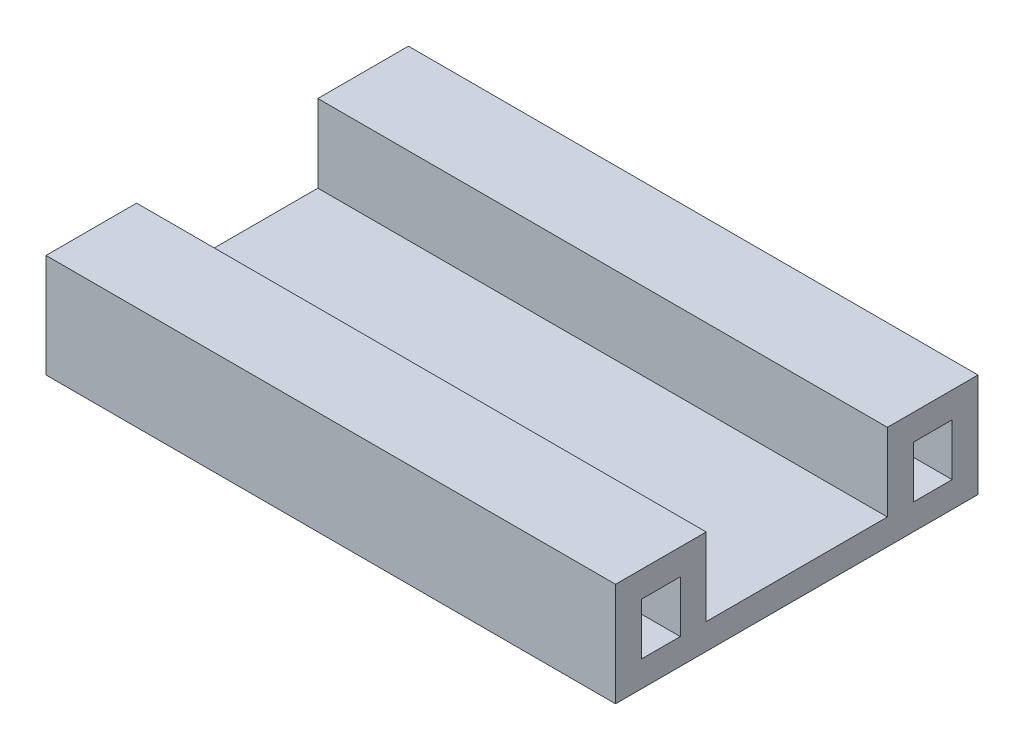
ISO-10303-21;
HEADER;
FILE_DESCRIPTION(('STEP AP214'),'2;1');
FILE_NAME('part.step','',(''),(''),'','','');
FILE_SCHEMA(('AUTOMOTIVE_DESIGN { 1 0 10303 214 1 1 1 1 }'));
ENDSEC;
DATA;
#1=APPLICATION_CONTEXT('core data for automotive mechanical design processes');
#2=APPLICATION_PROTOCOL_DEFINITION('international standard','automotive_design',2000,#1);
#3=PRODUCT_CONTEXT('',#1,'mechanical');
#4=PRODUCT('Part','Part','',(#3));
#5=PRODUCT_RELATED_PRODUCT_CATEGORY('part','',(#4));
#6=PRODUCT_DEFINITION_FORMATION('','',#4);
#7=PRODUCT_DEFINITION_CONTEXT('part definition',#1,'design');
#8=PRODUCT_DEFINITION('design','',#6,#7);
#9=PRODUCT_DEFINITION_SHAPE('','',#8);
#10=(LENGTH_UNIT() NAMED_UNIT(*) SI_UNIT(.MILLI.,.METRE.));
#11=(NAMED_UNIT(*) PLANE_ANGLE_UNIT() SI_UNIT($,.RADIAN.));
#12=(NAMED_UNIT(*) SI_UNIT($,.STERADIAN.) SOLID_ANGLE_UNIT());
#13=UNCERTAINTY_MEASURE_WITH_UNIT(LENGTH_MEASURE(1.E-05),#10,'distance_accuracy_value','');
#14=(GEOMETRIC_REPRESENTATION_CONTEXT(3) GLOBAL_UNCERTAINTY_ASSIGNED_CONTEXT((#13)) GLOBAL_UNIT_ASSIGNED_CONTEXT((#10,
#11,#12)) REPRESENTATION_CONTEXT('',''));
#15=CARTESIAN_POINT('',(0.,0.,0.));
#16=DIRECTION('',(0.,0.,1.));
#17=DIRECTION('',(1.,0.,0.));
#18=AXIS2_PLACEMENT_3D('',#15,#16,#17);
#19=CARTESIAN_POINT('',(0.,10.,0.));
#20=DIRECTION('',(0.,1.,0.));
#21=DIRECTION('',(0.,0.,1.));
#22=AXIS2_PLACEMENT_3D('',#19,#20,#21);
#23=PLANE('',#22);
#24=DIRECTION('',(1.,0.,0.));
#25=VECTOR('',#24,1.);
#26=CARTESIAN_POINT('',(-110.,10.,35.));
#27=LINE('',#26,#25);
#28=CARTESIAN_POINT('',(-110.,10.,35.));
#29=VERTEX_POINT('',#28);
#30=CARTESIAN_POINT('',(110.,10.,35.));
#31=VERTEX_POINT('',#30);
#32=EDGE_CURVE('E170',#29,#31,#27,.T.);
#33=ORIENTED_EDGE('',*,*,#32,.T.);
#34=DIRECTION('',(0.,0.,-1.));
#35=VECTOR('',#34,1.);
#36=CARTESIAN_POINT('',(110.,10.,-70.));
#37=LINE('',#36,#35);
#38=CARTESIAN_POINT('',(110.,10.,-35.));
#39=VERTEX_POINT('',#38);
#40=EDGE_CURVE('E250',#31,#39,#37,.T.);
#41=ORIENTED_EDGE('',*,*,#40,.T.);
#42=DIRECTION('',(1.,0.,0.));
#43=VECTOR('',#42,1.);
#44=CARTESIAN_POINT('',(-110.,10.,-35.));
#45=LINE('',#44,#43);
#46=CARTESIAN_POINT('',(-110.,10.,-35.));
#47=VERTEX_POINT('',#46);
#48=EDGE_CURVE('E184',#47,#39,#45,.T.);
#49=ORIENTED_EDGE('',*,*,#48,.F.);
#50=DIRECTION('',(0.,0.,1.));
#51=VECTOR('',#50,1.);
#52=CARTESIAN_POINT('',(-110.,10.,-70.));
#53=LINE('',#52,#51);
#54=EDGE_CURVE('E161',#47,#29,#53,.T.);
#55=ORIENTED_EDGE('',*,*,#54,.T.);
#56=EDGE_LOOP('',(#33,#41,#49,#55));
#57=FACE_BOUND('',#56,.T.);
#58=ADVANCED_FACE('F35',(#57),#23,.T.);
#59=DIRECTION('',(-1.,0.,0.));
#60=VECTOR('',#59,1.);
#61=CARTESIAN_POINT('',(-110.,10.,45.));
#62=LINE('',#61,#60);
#63=CARTESIAN_POINT('',(110.,10.,45.));
#64=VERTEX_POINT('',#63);
#65=CARTESIAN_POINT('',(-110.,10.,45.));
#66=VERTEX_POINT('',#65);
#67=EDGE_CURVE('E165',#64,#66,#62,.T.);
#68=ORIENTED_EDGE('',*,*,#67,.T.);
#69=CARTESIAN_POINT('',(-110.,10.,60.));
#70=VERTEX_POINT('',#69);
#71=EDGE_CURVE('E152',#66,#70,#53,.T.);
#72=ORIENTED_EDGE('',*,*,#71,.T.);
#73=DIRECTION('',(-1.,0.,0.));
#74=VECTOR('',#73,1.);
#75=CARTESIAN_POINT('',(-110.,10.,60.));
#76=LINE('',#75,#74);
#77=CARTESIAN_POINT('',(110.,10.,60.));
#78=VERTEX_POINT('',#77);
#79=EDGE_CURVE('E236',#78,#70,#76,.T.);
#80=ORIENTED_EDGE('',*,*,#79,.F.);
#81=EDGE_CURVE('E58',#78,#64,#37,.T.);
#82=ORIENTED_EDGE('',*,*,#81,.T.);
#83=EDGE_LOOP('',(#68,#72,#80,#82));
#84=FACE_BOUND('',#83,.T.);
#85=ADVANCED_FACE('F166',(#84),#23,.T.);
#86=CARTESIAN_POINT('',(-110.,10.,-60.));
#87=VERTEX_POINT('',#86);
#88=CARTESIAN_POINT('',(-110.,10.,-45.));
#89=VERTEX_POINT('',#88);
#90=EDGE_CURVE('E163',#87,#89,#53,.T.);
#91=ORIENTED_EDGE('',*,*,#90,.T.);
#92=DIRECTION('',(-1.,0.,0.));
#93=VECTOR('',#92,1.);
#94=CARTESIAN_POINT('',(-110.,10.,-45.));
#95=LINE('',#94,#93);
#96=CARTESIAN_POINT('',(110.,10.,-45.));
#97=VERTEX_POINT('',#96);
#98=EDGE_CURVE('E180',#97,#89,#95,.T.);
#99=ORIENTED_EDGE('',*,*,#98,.F.);
#100=CARTESIAN_POINT('',(110.,10.,-60.));
#101=VERTEX_POINT('',#100);
#102=EDGE_CURVE('E251',#97,#101,#37,.T.);
#103=ORIENTED_EDGE('',*,*,#102,.T.);
#104=DIRECTION('',(1.,0.,0.));
#105=VECTOR('',#104,1.);
#106=CARTESIAN_POINT('',(-110.,10.,-60.));
#107=LINE('',#106,#105);
#108=EDGE_CURVE('E220',#87,#101,#107,.T.);
#109=ORIENTED_EDGE('',*,*,#108,.F.);
#110=EDGE_LOOP('',(#91,#99,#103,#109));
#111=FACE_BOUND('',#110,.T.);
#112=ADVANCED_FACE('F301',(#111),#23,.T.);
#113=CARTESIAN_POINT('',(-110.,30.,-35.));
#114=DIRECTION('',(0.,1.,0.));
#115=DIRECTION('',(0.,0.,1.));
#116=AXIS2_PLACEMENT_3D('',#113,#114,#115);
#117=PLANE('',#116);
#118=DIRECTION('',(1.,0.,0.));
#119=VECTOR('',#118,1.);
#120=CARTESIAN_POINT('',(-110.,30.,-45.));
#121=LINE('',#120,#119);
#122=CARTESIAN_POINT('',(-110.,30.,-45.));
#123=VERTEX_POINT('',#122);
#124=CARTESIAN_POINT('',(110.,30.,-45.));
#125=VERTEX_POINT('',#124);
#126=EDGE_CURVE('E169',#123,#125,#121,.T.);
#127=ORIENTED_EDGE('',*,*,#126,.F.);
#128=DIRECTION('',(0.,0.,-1.));
#129=VECTOR('',#128,1.);
#130=CARTESIAN_POINT('',(-110.,30.,-35.));
#131=LINE('',#130,#129);
#132=CARTESIAN_POINT('',(-110.,30.,-60.));
#133=VERTEX_POINT('',#132);
#134=EDGE_CURVE('E218',#123,#133,#131,.T.);
#135=ORIENTED_EDGE('',*,*,#134,.T.);
#136=DIRECTION('',(1.,0.,0.));
#137=VECTOR('',#136,1.);
#138=CARTESIAN_POINT('',(-110.,30.,-60.));
#139=LINE('',#138,#137);
#140=CARTESIAN_POINT('',(110.,30.,-60.));
#141=VERTEX_POINT('',#140);
#142=EDGE_CURVE('E205',#133,#141,#139,.T.);
#143=ORIENTED_EDGE('',*,*,#142,.T.);
#144=DIRECTION('',(0.,0.,-1.));
#145=VECTOR('',#144,1.);
#146=CARTESIAN_POINT('',(110.,30.,-35.));
#147=LINE('',#146,#145);
#148=EDGE_CURVE('E214',#125,#141,#147,.T.);
#149=ORIENTED_EDGE('',*,*,#148,.F.);
#150=EDGE_LOOP('',(#127,#135,#143,#149));
#151=FACE_BOUND('',#150,.T.);
#152=ADVANCED_FACE('F317',(#151),#117,.F.);
#153=CARTESIAN_POINT('',(-110.,40.,-60.));
#154=DIRECTION('',(0.,0.,-1.));
#155=DIRECTION('',(-1.,0.,0.));
#156=AXIS2_PLACEMENT_3D('',#153,#154,#155);
#157=PLANE('',#156);
#158=ORIENTED_EDGE('',*,*,#142,.F.);
#159=DIRECTION('',(0.,-1.,0.));
#160=VECTOR('',#159,1.);
#161=CARTESIAN_POINT('',(-110.,40.,-60.));
#162=LINE('',#161,#160);
#163=EDGE_CURVE('E234',#133,#87,#162,.T.);
#164=ORIENTED_EDGE('',*,*,#163,.T.);
#165=ORIENTED_EDGE('',*,*,#108,.T.);
#166=DIRECTION('',(0.,-1.,0.));
#167=VECTOR('',#166,1.);
#168=CARTESIAN_POINT('',(110.,40.,-60.));
#169=LINE('',#168,#167);
#170=EDGE_CURVE('E229',#141,#101,#169,.T.);
#171=ORIENTED_EDGE('',*,*,#170,.F.);
#172=EDGE_LOOP('',(#158,#164,#165,#171));
#173=FACE_BOUND('',#172,.T.);
#174=ADVANCED_FACE('F309',(#173),#157,.F.);
#175=CARTESIAN_POINT('',(110.,10.,-70.));
#176=DIRECTION('',(-1.,0.,0.));
#177=DIRECTION('',(0.,0.,1.));
#178=AXIS2_PLACEMENT_3D('',#175,#176,#177);
#179=PLANE('',#178);
#180=DIRECTION('',(0.,1.,0.));
#181=VECTOR('',#180,1.);
#182=CARTESIAN_POINT('',(110.,-210.227155455452,45.));
#183=LINE('',#182,#181);
#184=CARTESIAN_POINT('',(110.,30.,45.));
#185=VERTEX_POINT('',#184);
#186=EDGE_CURVE('E174',#64,#185,#183,.T.);
#187=ORIENTED_EDGE('',*,*,#186,.F.);
#188=ORIENTED_EDGE('',*,*,#81,.F.);
#189=DIRECTION('',(0.,-1.,0.));
#190=VECTOR('',#189,1.);
#191=CARTESIAN_POINT('',(110.,40.,60.));
#192=LINE('',#191,#190);
#193=CARTESIAN_POINT('',(110.,30.,60.));
#194=VERTEX_POINT('',#193);
#195=EDGE_CURVE('E247',#194,#78,#192,.T.);
#196=ORIENTED_EDGE('',*,*,#195,.F.);
#197=DIRECTION('',(0.,0.,1.));
#198=VECTOR('',#197,1.);
#199=CARTESIAN_POINT('',(110.,30.,35.));
#200=LINE('',#199,#198);
#201=EDGE_CURVE('E203',#185,#194,#200,.T.);
#202=ORIENTED_EDGE('',*,*,#201,.F.);
#203=EDGE_LOOP('',(#187,#188,#196,#202));
#204=FACE_BOUND('',#203,.T.);
#205=ORIENTED_EDGE('',*,*,#102,.F.);
#206=DIRECTION('',(0.,1.,0.));
#207=VECTOR('',#206,1.);
#208=CARTESIAN_POINT('',(110.,-210.227155455452,-45.));
#209=LINE('',#208,#207);
#210=EDGE_CURVE('E187',#97,#125,#209,.T.);
#211=ORIENTED_EDGE('',*,*,#210,.T.);
#212=ORIENTED_EDGE('',*,*,#148,.T.);
#213=ORIENTED_EDGE('',*,*,#170,.T.);
#214=EDGE_LOOP('',(#205,#211,#212,#213));
#215=FACE_BOUND('',#214,.T.);
#216=DIRECTION('',(0.,0.,-1.));
#217=VECTOR('',#216,1.);
#218=CARTESIAN_POINT('',(110.,0.,-70.));
#219=LINE('',#218,#217);
#220=CARTESIAN_POINT('',(110.,0.,70.));
#221=VERTEX_POINT('',#220);
#222=CARTESIAN_POINT('',(110.,0.,-70.));
#223=VERTEX_POINT('',#222);
#224=EDGE_CURVE('E249',#221,#223,#219,.T.);
#225=ORIENTED_EDGE('',*,*,#224,.T.);
#226=DIRECTION('',(0.,-1.,0.));
#227=VECTOR('',#226,1.);
#228=CARTESIAN_POINT('',(110.,10.,-70.));
#229=LINE('',#228,#227);
#230=CARTESIAN_POINT('',(110.,40.,-70.));
#231=VERTEX_POINT('',#230);
#232=EDGE_CURVE('E11',#231,#223,#229,.T.);
#233=ORIENTED_EDGE('',*,*,#232,.F.);
#234=DIRECTION('',(0.,0.,-1.));
#235=VECTOR('',#234,1.);
#236=CARTESIAN_POINT('',(110.,40.,-70.));
#237=LINE('',#236,#235);
#238=CARTESIAN_POINT('',(110.,40.,-35.));
#239=VERTEX_POINT('',#238);
#240=EDGE_CURVE('E223',#239,#231,#237,.T.);
#241=ORIENTED_EDGE('',*,*,#240,.F.);
#242=DIRECTION('',(0.,1.,0.));
#243=VECTOR('',#242,1.);
#244=CARTESIAN_POINT('',(110.,40.,-35.));
#245=LINE('',#244,#243);
#246=EDGE_CURVE('E208',#39,#239,#245,.T.);
#247=ORIENTED_EDGE('',*,*,#246,.F.);
#248=ORIENTED_EDGE('',*,*,#40,.F.);
#249=DIRECTION('',(0.,1.,0.));
#250=VECTOR('',#249,1.);
#251=CARTESIAN_POINT('',(110.,40.,35.));
#252=LINE('',#251,#250);
#253=CARTESIAN_POINT('',(110.,40.,35.));
#254=VERTEX_POINT('',#253);
#255=EDGE_CURVE('E50',#31,#254,#252,.T.);
#256=ORIENTED_EDGE('',*,*,#255,.T.);
#257=DIRECTION('',(0.,0.,-1.));
#258=VECTOR('',#257,1.);
#259=CARTESIAN_POINT('',(110.,40.,60.));
#260=LINE('',#259,#258);
#261=CARTESIAN_POINT('',(110.,40.,70.));
#262=VERTEX_POINT('',#261);
#263=EDGE_CURVE('E237',#262,#254,#260,.T.);
#264=ORIENTED_EDGE('',*,*,#263,.F.);
#265=DIRECTION('',(0.,-1.,0.));
#266=VECTOR('',#265,1.);
#267=CARTESIAN_POINT('',(110.,10.,70.));
#268=LINE('',#267,#266);
#269=EDGE_CURVE('E253',#262,#221,#268,.T.);
#270=ORIENTED_EDGE('',*,*,#269,.T.);
#271=EDGE_LOOP('',(#225,#233,#241,#247,#248,#256,#264,#270));
#272=FACE_BOUND('',#271,.T.);
#273=ADVANCED_FACE('F37',(#204,#215,#272),#179,.F.);
#274=CARTESIAN_POINT('',(-110.,10.,-70.));
#275=DIRECTION('',(0.,0.,1.));
#276=DIRECTION('',(1.,0.,0.));
#277=AXIS2_PLACEMENT_3D('',#274,#275,#276);
#278=PLANE('',#277);
#279=DIRECTION('',(-1.,0.,0.));
#280=VECTOR('',#279,1.);
#281=CARTESIAN_POINT('',(-110.,0.,-70.));
#282=LINE('',#281,#280);
#283=CARTESIAN_POINT('',(-110.,0.,-70.));
#284=VERTEX_POINT('',#283);
#285=EDGE_CURVE('E256',#223,#284,#282,.T.);
#286=ORIENTED_EDGE('',*,*,#285,.T.);
#287=DIRECTION('',(0.,-1.,0.));
#288=VECTOR('',#287,1.);
#289=CARTESIAN_POINT('',(-110.,10.,-70.));
#290=LINE('',#289,#288);
#291=CARTESIAN_POINT('',(-110.,40.,-70.));
#292=VERTEX_POINT('',#291);
#293=EDGE_CURVE('E43',#292,#284,#290,.T.);
#294=ORIENTED_EDGE('',*,*,#293,.F.);
#295=DIRECTION('',(-1.,0.,0.));
#296=VECTOR('',#295,1.);
#297=CARTESIAN_POINT('',(-110.,40.,-70.));
#298=LINE('',#297,#296);
#299=EDGE_CURVE('E226',#231,#292,#298,.T.);
#300=ORIENTED_EDGE('',*,*,#299,.F.);
#301=ORIENTED_EDGE('',*,*,#232,.T.);
#302=EDGE_LOOP('',(#286,#294,#300,#301));
#303=FACE_BOUND('',#302,.T.);
#304=ADVANCED_FACE('F297',(#303),#278,.F.);
#305=CARTESIAN_POINT('',(-110.,10.,-70.));
#306=DIRECTION('',(1.,0.,0.));
#307=DIRECTION('',(0.,0.,-1.));
#308=AXIS2_PLACEMENT_3D('',#305,#306,#307);
#309=PLANE('',#308);
#310=DIRECTION('',(0.,-1.,0.));
#311=VECTOR('',#310,1.);
#312=CARTESIAN_POINT('',(-110.,40.,35.));
#313=LINE('',#312,#311);
#314=CARTESIAN_POINT('',(-110.,40.,35.));
#315=VERTEX_POINT('',#314);
#316=EDGE_CURVE('E193',#315,#29,#313,.T.);
#317=ORIENTED_EDGE('',*,*,#316,.T.);
#318=ORIENTED_EDGE('',*,*,#54,.F.);
#319=DIRECTION('',(0.,-1.,0.));
#320=VECTOR('',#319,1.);
#321=CARTESIAN_POINT('',(-110.,40.,-35.));
#322=LINE('',#321,#320);
#323=CARTESIAN_POINT('',(-110.,40.,-35.));
#324=VERTEX_POINT('',#323);
#325=EDGE_CURVE('E206',#324,#47,#322,.T.);
#326=ORIENTED_EDGE('',*,*,#325,.F.);
#327=DIRECTION('',(0.,0.,1.));
#328=VECTOR('',#327,1.);
#329=CARTESIAN_POINT('',(-110.,40.,-70.));
#330=LINE('',#329,#328);
#331=EDGE_CURVE('E221',#292,#324,#330,.T.);
#332=ORIENTED_EDGE('',*,*,#331,.F.);
#333=ORIENTED_EDGE('',*,*,#293,.T.);
#334=DIRECTION('',(0.,0.,1.));
#335=VECTOR('',#334,1.);
#336=CARTESIAN_POINT('',(-110.,0.,-70.));
#337=LINE('',#336,#335);
#338=CARTESIAN_POINT('',(-110.,0.,70.));
#339=VERTEX_POINT('',#338);
#340=EDGE_CURVE('E258',#284,#339,#337,.T.);
#341=ORIENTED_EDGE('',*,*,#340,.T.);
#342=DIRECTION('',(0.,-1.,0.));
#343=VECTOR('',#342,1.);
#344=CARTESIAN_POINT('',(-110.,10.,70.));
#345=LINE('',#344,#343);
#346=CARTESIAN_POINT('',(-110.,40.,70.));
#347=VERTEX_POINT('',#346);
#348=EDGE_CURVE('E264',#347,#339,#345,.T.);
#349=ORIENTED_EDGE('',*,*,#348,.F.);
#350=DIRECTION('',(0.,0.,1.));
#351=VECTOR('',#350,1.);
#352=CARTESIAN_POINT('',(-110.,40.,60.));
#353=LINE('',#352,#351);
#354=EDGE_CURVE('E239',#315,#347,#353,.T.);
#355=ORIENTED_EDGE('',*,*,#354,.F.);
#356=EDGE_LOOP('',(#317,#318,#326,#332,#333,#341,#349,#355));
#357=FACE_BOUND('',#356,.T.);
#358=ORIENTED_EDGE('',*,*,#71,.F.);
#359=DIRECTION('',(0.,1.,0.));
#360=VECTOR('',#359,1.);
#361=CARTESIAN_POINT('',(-110.,-210.227155455452,45.));
#362=LINE('',#361,#360);
#363=CARTESIAN_POINT('',(-110.,30.,45.));
#364=VERTEX_POINT('',#363);
#365=EDGE_CURVE('E156',#66,#364,#362,.T.);
#366=ORIENTED_EDGE('',*,*,#365,.T.);
#367=DIRECTION('',(0.,0.,1.));
#368=VECTOR('',#367,1.);
#369=CARTESIAN_POINT('',(-110.,30.,35.));
#370=LINE('',#369,#368);
#371=CARTESIAN_POINT('',(-110.,30.,60.));
#372=VERTEX_POINT('',#371);
#373=EDGE_CURVE('E199',#364,#372,#370,.T.);
#374=ORIENTED_EDGE('',*,*,#373,.T.);
#375=DIRECTION('',(0.,-1.,0.));
#376=VECTOR('',#375,1.);
#377=CARTESIAN_POINT('',(-110.,40.,60.));
#378=LINE('',#377,#376);
#379=EDGE_CURVE('E159',#372,#70,#378,.T.);
#380=ORIENTED_EDGE('',*,*,#379,.T.);
#381=EDGE_LOOP('',(#358,#366,#374,#380));
#382=FACE_BOUND('',#381,.T.);
#383=DIRECTION('',(0.,1.,0.));
#384=VECTOR('',#383,1.);
#385=CARTESIAN_POINT('',(-110.,-210.227155455452,-45.));
#386=LINE('',#385,#384);
#387=EDGE_CURVE('E189',#89,#123,#386,.T.);
#388=ORIENTED_EDGE('',*,*,#387,.F.);
#389=ORIENTED_EDGE('',*,*,#90,.F.);
#390=ORIENTED_EDGE('',*,*,#163,.F.);
#391=ORIENTED_EDGE('',*,*,#134,.F.);
#392=EDGE_LOOP('',(#388,#389,#390,#391));
#393=FACE_BOUND('',#392,.T.);
#394=ADVANCED_FACE('F153',(#357,#382,#393),#309,.F.);
#395=CARTESIAN_POINT('',(-110.,10.,70.));
#396=DIRECTION('',(0.,0.,-1.));
#397=DIRECTION('',(-1.,0.,0.));
#398=AXIS2_PLACEMENT_3D('',#395,#396,#397);
#399=PLANE('',#398);
#400=DIRECTION('',(1.,0.,0.));
#401=VECTOR('',#400,1.);
#402=CARTESIAN_POINT('',(-110.,0.,70.));
#403=LINE('',#402,#401);
#404=EDGE_CURVE('E260',#339,#221,#403,.T.);
#405=ORIENTED_EDGE('',*,*,#404,.T.);
#406=ORIENTED_EDGE('',*,*,#269,.F.);
#407=DIRECTION('',(1.,0.,0.));
#408=VECTOR('',#407,1.);
#409=CARTESIAN_POINT('',(-110.,40.,70.));
#410=LINE('',#409,#408);
#411=EDGE_CURVE('E242',#347,#262,#410,.T.);
#412=ORIENTED_EDGE('',*,*,#411,.F.);
#413=ORIENTED_EDGE('',*,*,#348,.T.);
#414=EDGE_LOOP('',(#405,#406,#412,#413));
#415=FACE_BOUND('',#414,.T.);
#416=ADVANCED_FACE('F278',(#415),#399,.F.);
#417=CARTESIAN_POINT('',(0.,0.,0.));
#418=DIRECTION('',(0.,1.,0.));
#419=DIRECTION('',(0.,0.,1.));
#420=AXIS2_PLACEMENT_3D('',#417,#418,#419);
#421=PLANE('',#420);
#422=ORIENTED_EDGE('',*,*,#224,.F.);
#423=ORIENTED_EDGE('',*,*,#404,.F.);
#424=ORIENTED_EDGE('',*,*,#340,.F.);
#425=ORIENTED_EDGE('',*,*,#285,.F.);
#426=EDGE_LOOP('',(#422,#423,#424,#425));
#427=FACE_BOUND('',#426,.T.);
#428=ADVANCED_FACE('F276',(#427),#421,.F.);
#429=CARTESIAN_POINT('',(-110.,40.,60.));
#430=DIRECTION('',(0.,0.,1.));
#431=DIRECTION('',(1.,0.,0.));
#432=AXIS2_PLACEMENT_3D('',#429,#430,#431);
#433=PLANE('',#432);
#434=ORIENTED_EDGE('',*,*,#379,.F.);
#435=DIRECTION('',(1.,0.,0.));
#436=VECTOR('',#435,1.);
#437=CARTESIAN_POINT('',(-110.,30.,60.));
#438=LINE('',#437,#436);
#439=EDGE_CURVE('E183',#372,#194,#438,.T.);
#440=ORIENTED_EDGE('',*,*,#439,.T.);
#441=ORIENTED_EDGE('',*,*,#195,.T.);
#442=ORIENTED_EDGE('',*,*,#79,.T.);
#443=EDGE_LOOP('',(#434,#440,#441,#442));
#444=FACE_BOUND('',#443,.T.);
#445=ADVANCED_FACE('F334',(#444),#433,.F.);
#446=CARTESIAN_POINT('',(0.,40.,0.));
#447=DIRECTION('',(0.,1.,0.));
#448=DIRECTION('',(0.,0.,1.));
#449=AXIS2_PLACEMENT_3D('',#446,#447,#448);
#450=PLANE('',#449);
#451=ORIENTED_EDGE('',*,*,#263,.T.);
#452=DIRECTION('',(-1.,0.,0.));
#453=VECTOR('',#452,1.);
#454=CARTESIAN_POINT('',(-110.,40.,35.));
#455=LINE('',#454,#453);
#456=EDGE_CURVE('E195',#254,#315,#455,.T.);
#457=ORIENTED_EDGE('',*,*,#456,.T.);
#458=ORIENTED_EDGE('',*,*,#354,.T.);
#459=ORIENTED_EDGE('',*,*,#411,.T.);
#460=EDGE_LOOP('',(#451,#457,#458,#459));
#461=FACE_BOUND('',#460,.T.);
#462=ADVANCED_FACE('F284',(#461),#450,.T.);
#463=CARTESIAN_POINT('',(0.,40.,0.));
#464=DIRECTION('',(0.,1.,0.));
#465=DIRECTION('',(0.,0.,1.));
#466=AXIS2_PLACEMENT_3D('',#463,#464,#465);
#467=PLANE('',#466);
#468=ORIENTED_EDGE('',*,*,#331,.T.);
#469=DIRECTION('',(-1.,0.,0.));
#470=VECTOR('',#469,1.);
#471=CARTESIAN_POINT('',(-110.,40.,-35.));
#472=LINE('',#471,#470);
#473=EDGE_CURVE('E211',#239,#324,#472,.T.);
#474=ORIENTED_EDGE('',*,*,#473,.F.);
#475=ORIENTED_EDGE('',*,*,#240,.T.);
#476=ORIENTED_EDGE('',*,*,#299,.T.);
#477=EDGE_LOOP('',(#468,#474,#475,#476));
#478=FACE_BOUND('',#477,.T.);
#479=ADVANCED_FACE('F296',(#478),#467,.T.);
#480=CARTESIAN_POINT('',(0.,0.,-35.));
#481=DIRECTION('',(0.,0.,1.));
#482=DIRECTION('',(1.,0.,0.));
#483=AXIS2_PLACEMENT_3D('',#480,#481,#482);
#484=PLANE('',#483);
#485=ORIENTED_EDGE('',*,*,#325,.T.);
#486=ORIENTED_EDGE('',*,*,#48,.T.);
#487=ORIENTED_EDGE('',*,*,#246,.T.);
#488=ORIENTED_EDGE('',*,*,#473,.T.);
#489=EDGE_LOOP('',(#485,#486,#487,#488));
#490=FACE_BOUND('',#489,.T.);
#491=ADVANCED_FACE('F293',(#490),#484,.T.);
#492=CARTESIAN_POINT('',(-110.,30.,35.));
#493=DIRECTION('',(0.,-1.,0.));
#494=DIRECTION('',(0.,0.,-1.));
#495=AXIS2_PLACEMENT_3D('',#492,#493,#494);
#496=PLANE('',#495);
#497=DIRECTION('',(1.,0.,0.));
#498=VECTOR('',#497,1.);
#499=CARTESIAN_POINT('',(-110.,30.,45.));
#500=LINE('',#499,#498);
#501=EDGE_CURVE('E173',#364,#185,#500,.T.);
#502=ORIENTED_EDGE('',*,*,#501,.T.);
#503=ORIENTED_EDGE('',*,*,#201,.T.);
#504=ORIENTED_EDGE('',*,*,#439,.F.);
#505=ORIENTED_EDGE('',*,*,#373,.F.);
#506=EDGE_LOOP('',(#502,#503,#504,#505));
#507=FACE_BOUND('',#506,.T.);
#508=ADVANCED_FACE('F352',(#507),#496,.T.);
#509=CARTESIAN_POINT('',(0.,0.,35.));
#510=DIRECTION('',(0.,0.,-1.));
#511=DIRECTION('',(1.,0.,0.));
#512=AXIS2_PLACEMENT_3D('',#509,#510,#511);
#513=PLANE('',#512);
#514=ORIENTED_EDGE('',*,*,#316,.F.);
#515=ORIENTED_EDGE('',*,*,#456,.F.);
#516=ORIENTED_EDGE('',*,*,#255,.F.);
#517=ORIENTED_EDGE('',*,*,#32,.F.);
#518=EDGE_LOOP('',(#514,#515,#516,#517));
#519=FACE_BOUND('',#518,.T.);
#520=ADVANCED_FACE('F286',(#519),#513,.T.);
#521=CARTESIAN_POINT('',(-110.,-210.227155455452,-45.));
#522=DIRECTION('',(0.,0.,1.));
#523=DIRECTION('',(1.,0.,0.));
#524=AXIS2_PLACEMENT_3D('',#521,#522,#523);
#525=PLANE('',#524);
#526=ORIENTED_EDGE('',*,*,#210,.F.);
#527=ORIENTED_EDGE('',*,*,#98,.T.);
#528=ORIENTED_EDGE('',*,*,#387,.T.);
#529=ORIENTED_EDGE('',*,*,#126,.T.);
#530=EDGE_LOOP('',(#526,#527,#528,#529));
#531=FACE_BOUND('',#530,.T.);
#532=ADVANCED_FACE('F315',(#531),#525,.F.);
#533=CARTESIAN_POINT('',(-110.,-210.227155455452,45.));
#534=DIRECTION('',(0.,0.,1.));
#535=DIRECTION('',(1.,0.,0.));
#536=AXIS2_PLACEMENT_3D('',#533,#534,#535);
#537=PLANE('',#536);
#538=ORIENTED_EDGE('',*,*,#67,.F.);
#539=ORIENTED_EDGE('',*,*,#186,.T.);
#540=ORIENTED_EDGE('',*,*,#501,.F.);
#541=ORIENTED_EDGE('',*,*,#365,.F.);
#542=EDGE_LOOP('',(#538,#539,#540,#541));
#543=FACE_BOUND('',#542,.T.);
#544=ADVANCED_FACE('F172',(#543),#537,.T.);
#545=CLOSED_SHELL('',(#58,#85,#112,#152,#174,#273,#304,#394,#416,#428,#445,#462,#479,#491,#508,
#520,#532,#544));
#546=MANIFOLD_SOLID_BREP('B2',#545);
#547=ADVANCED_BREP_SHAPE_REPRESENTATION('',(#18,#546),#14);
#548=SHAPE_DEFINITION_REPRESENTATION(#9,#547);
ENDSEC;
END-ISO-10303-21;
